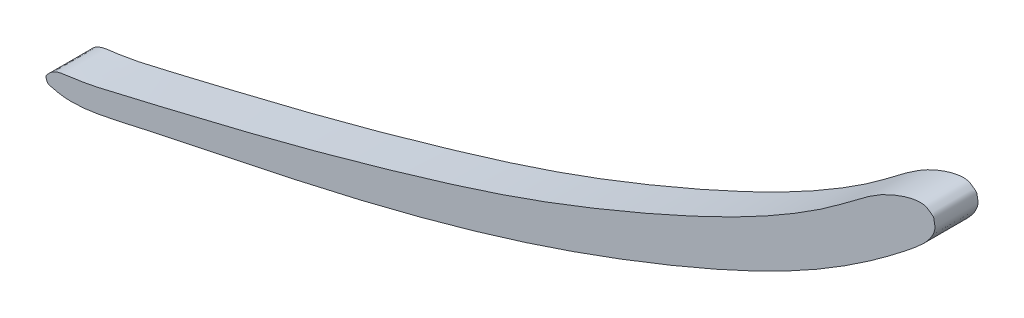
ISO-10303-21;
HEADER;
FILE_DESCRIPTION(('STEP AP214'),'2;1');
FILE_NAME('part.step','',(''),(''),'','','');
FILE_SCHEMA(('AUTOMOTIVE_DESIGN { 1 0 10303 214 1 1 1 1 }'));
ENDSEC;
DATA;
#1=APPLICATION_CONTEXT('core data for automotive mechanical design processes');
#2=APPLICATION_PROTOCOL_DEFINITION('international standard','automotive_design',2000,#1);
#3=PRODUCT_CONTEXT('',#1,'mechanical');
#4=PRODUCT('Part','Part','',(#3));
#5=PRODUCT_RELATED_PRODUCT_CATEGORY('part','',(#4));
#6=PRODUCT_DEFINITION_FORMATION('','',#4);
#7=PRODUCT_DEFINITION_CONTEXT('part definition',#1,'design');
#8=PRODUCT_DEFINITION('design','',#6,#7);
#9=PRODUCT_DEFINITION_SHAPE('','',#8);
#10=(LENGTH_UNIT() NAMED_UNIT(*) SI_UNIT(.MILLI.,.METRE.));
#11=(NAMED_UNIT(*) PLANE_ANGLE_UNIT() SI_UNIT($,.RADIAN.));
#12=(NAMED_UNIT(*) SI_UNIT($,.STERADIAN.) SOLID_ANGLE_UNIT());
#13=UNCERTAINTY_MEASURE_WITH_UNIT(LENGTH_MEASURE(1.E-05),#10,'distance_accuracy_value','');
#14=(GEOMETRIC_REPRESENTATION_CONTEXT(3) GLOBAL_UNCERTAINTY_ASSIGNED_CONTEXT((#13)) GLOBAL_UNIT_ASSIGNED_CONTEXT((#10,
#11,#12)) REPRESENTATION_CONTEXT('',''));
#15=CARTESIAN_POINT('',(0.,0.,0.));
#16=DIRECTION('',(0.,0.,1.));
#17=DIRECTION('',(1.,0.,0.));
#18=AXIS2_PLACEMENT_3D('',#15,#16,#17);
#19=CARTESIAN_POINT('',(94.8993334063321,0.,236.));
#20=CARTESIAN_POINT('',(94.845659962282,0.10574347563716,236.));
#21=CARTESIAN_POINT('',(94.7575121961252,0.184789814009305,236.));
#22=CARTESIAN_POINT('',(94.5752324341787,0.331419849592051,236.));
#23=CARTESIAN_POINT('',(94.4797080052577,0.398887362654459,236.));
#24=CARTESIAN_POINT('',(94.2915303185674,0.537651560472318,236.));
#25=CARTESIAN_POINT('',(94.1987281030679,0.608749585971756,236.));
#26=CARTESIAN_POINT('',(94.0082274871494,0.744415781485045,236.));
#27=CARTESIAN_POINT('',(93.9106305464372,0.808993365388635,236.));
#28=CARTESIAN_POINT('',(93.7110634555962,0.927901913294511,236.));
#29=CARTESIAN_POINT('',(93.6088564237515,0.982334590551361,236.));
#30=CARTESIAN_POINT('',(93.3952170026852,1.07208449896127,236.));
#31=CARTESIAN_POINT('',(93.2832377250923,1.10777381099563,236.));
#32=CARTESIAN_POINT('',(92.9398253533877,1.18933912122585,236.));
#33=CARTESIAN_POINT('',(92.7084219061872,1.20881353192816,236.));
#34=CARTESIAN_POINT('',(92.2431673506536,1.21306127725326,236.));
#35=CARTESIAN_POINT('',(92.0085660183177,1.19696276883999,236.));
#36=CARTESIAN_POINT('',(91.5462446156635,1.14699858187851,236.));
#37=CARTESIAN_POINT('',(91.3172127955302,1.11292895073162,236.));
#38=CARTESIAN_POINT('',(90.6358296163531,0.98633608935454,236.));
#39=CARTESIAN_POINT('',(90.1888606354073,0.870837145947229,236.));
#40=CARTESIAN_POINT('',(89.3017422963028,0.610728391355328,236.));
#41=CARTESIAN_POINT('',(88.8608720042973,0.464242027258985,236.));
#42=CARTESIAN_POINT('',(87.9910265645425,0.144206180317177,236.));
#43=CARTESIAN_POINT('',(87.5631805195455,-0.0283074348496961,236.));
#44=CARTESIAN_POINT('',(86.2991738542889,-0.580336119384259,236.));
#45=CARTESIAN_POINT('',(85.4831837217098,-0.995467378512295,236.));
#46=CARTESIAN_POINT('',(83.112708951334,-2.37769964058918,236.));
#47=CARTESIAN_POINT('',(81.6309065104896,-3.47334237152288,236.));
#48=CARTESIAN_POINT('',(79.4256204048164,-5.14680176586649,236.));
#49=CARTESIAN_POINT('',(78.6926849649439,-5.70835547103491,236.));
#50=CARTESIAN_POINT('',(77.2164171648756,-6.81348954067823,236.));
#51=CARTESIAN_POINT('',(76.474251974588,-7.35908761248904,236.));
#52=CARTESIAN_POINT('',(74.2255779214643,-8.95754149200038,236.));
#53=CARTESIAN_POINT('',(72.6961443029432,-9.97076686766624,236.));
#54=CARTESIAN_POINT('',(69.5963703092606,-11.9265013827565,236.));
#55=CARTESIAN_POINT('',(68.0264697617931,-12.8697708601218,236.));
#56=CARTESIAN_POINT('',(64.8567850296274,-14.7046494407795,236.));
#57=CARTESIAN_POINT('',(63.2567477410818,-15.5958209989586,236.));
#58=CARTESIAN_POINT('',(60.0260420150196,-17.3252115044312,236.));
#59=CARTESIAN_POINT('',(58.3957153065694,-18.1640212048269,236.));
#60=CARTESIAN_POINT('',(55.1112165780077,-19.8004187921286,236.));
#61=CARTESIAN_POINT('',(53.4570793426944,-20.5980668121328,236.));
#62=CARTESIAN_POINT('',(50.1319107351389,-22.1641576577852,236.));
#63=CARTESIAN_POINT('',(48.4606430591419,-22.9327064860528,236.));
#64=CARTESIAN_POINT('',(43.4262180529838,-25.1993773488672,236.));
#65=CARTESIAN_POINT('',(40.0465822894201,-26.6581098173429,236.));
#66=CARTESIAN_POINT('',(33.2512701992013,-29.4875745922943,236.));
#67=CARTESIAN_POINT('',(29.8363752070499,-30.8583721150458,236.));
#68=CARTESIAN_POINT('',(22.9642977919051,-33.4921941887389,236.));
#69=CARTESIAN_POINT('',(19.504227101559,-34.7510328278099,236.));
#70=CARTESIAN_POINT('',(12.5431362385993,-37.1412530390086,236.));
#71=CARTESIAN_POINT('',(9.04228151569951,-38.2744401190943,236.));
#72=CARTESIAN_POINT('',(2.01358556682683,-40.4585324367449,236.));
#73=CARTESIAN_POINT('',(-1.51305224799162,-41.5130137631934,236.));
#74=CARTESIAN_POINT('',(-8.57869076777038,-43.5758347366254,236.));
#75=CARTESIAN_POINT('',(-12.1180672431602,-44.5845299271085,236.));
#76=CARTESIAN_POINT('',(-19.2128319026667,-46.5464530587658,236.));
#77=CARTESIAN_POINT('',(-22.768312200971,-47.497524978792,236.));
#78=CARTESIAN_POINT('',(-33.4559882572697,-50.2672577594373,236.));
#79=CARTESIAN_POINT('',(-40.6115264376822,-51.9965460023696,236.));
#80=CARTESIAN_POINT('',(-51.3469605504554,-54.578262709755,236.));
#81=CARTESIAN_POINT('',(-54.9270215352491,-55.4323445134834,236.));
#82=CARTESIAN_POINT('',(-59.408482704292,-56.4726589746531,236.));
#83=CARTESIAN_POINT('',(-60.3053792883959,-56.6782764626265,236.));
#84=CARTESIAN_POINT('',(-62.1072276632954,-57.0478429262739,236.));
#85=CARTESIAN_POINT('',(-63.0125379510804,-57.2101471671624,236.));
#86=CARTESIAN_POINT('',(-64.3792172031136,-57.4092217634968,236.));
#87=CARTESIAN_POINT('',(-64.8368888295141,-57.4654563544162,236.));
#88=CARTESIAN_POINT('',(-65.7527222495231,-57.575575842784,236.));
#89=CARTESIAN_POINT('',(-66.2101950778906,-57.6327634032875,236.));
#90=CARTESIAN_POINT('',(-67.1162494381898,-57.7897603497645,236.));
#91=CARTESIAN_POINT('',(-67.5658472350484,-57.884698110249,236.));
#92=CARTESIAN_POINT('',(-68.2212652755757,-58.11808191237,236.));
#93=CARTESIAN_POINT('',(-68.4366874033342,-58.2118440110858,236.));
#94=CARTESIAN_POINT('',(-68.8549800218126,-58.4541141360905,236.));
#95=CARTESIAN_POINT('',(-69.0448291336182,-58.5992446026175,236.));
#96=CARTESIAN_POINT('',(-69.3133343024742,-58.8371696234882,236.));
#97=CARTESIAN_POINT('',(-69.399594956957,-58.920508121404,236.));
#98=CARTESIAN_POINT('',(-69.568893492128,-59.09119252606,236.));
#99=CARTESIAN_POINT('',(-69.6535229445691,-59.1766337586494,236.));
#100=CARTESIAN_POINT('',(-69.8158723592367,-59.3540092957443,236.));
#101=CARTESIAN_POINT('',(-69.8956570645381,-59.444535845131,236.));
#102=CARTESIAN_POINT('',(-69.9793641545226,-59.6056575366219,236.));
#103=CARTESIAN_POINT('',(-69.9990405096811,-59.6622389454471,236.));
#104=CARTESIAN_POINT('',(-70.0164031243084,-59.7817574298725,236.));
#105=CARTESIAN_POINT('',(-70.0149620983814,-59.8422186552406,236.));
#106=CARTESIAN_POINT('',(-69.9927134889943,-60.0205506431109,236.));
#107=CARTESIAN_POINT('',(-69.9561626156857,-60.1364338742434,236.));
#108=CARTESIAN_POINT('',(-69.8757925359856,-60.3618990283482,236.));
#109=CARTESIAN_POINT('',(-69.8304408073495,-60.474706677242,236.));
#110=CARTESIAN_POINT('',(-69.7025491239283,-60.6772536066619,236.));
#111=CARTESIAN_POINT('',(-69.6117969218763,-60.7635344934487,236.));
#112=CARTESIAN_POINT('',(-69.3918010850457,-60.8632674701253,236.));
#113=CARTESIAN_POINT('',(-69.2736904419237,-60.8840727448937,236.));
#114=CARTESIAN_POINT('',(-69.0381596933242,-60.9281569223038,236.));
#115=CARTESIAN_POINT('',(-68.9204793621968,-60.9505921498527,236.));
#116=CARTESIAN_POINT('',(-68.6867319330921,-61.0027579343336,236.));
#117=CARTESIAN_POINT('',(-68.5702859018215,-61.0307770295553,236.));
#118=CARTESIAN_POINT('',(-68.221342867823,-61.116622825597,236.));
#119=CARTESIAN_POINT('',(-67.9894187713092,-61.1770431810379,236.));
#120=CARTESIAN_POINT('',(-67.2867933709865,-61.3272789207023,236.));
#121=CARTESIAN_POINT('',(-66.8107544301198,-61.3834435375895,236.));
#122=CARTESIAN_POINT('',(-65.8653959434507,-61.4451826564057,236.));
#123=CARTESIAN_POINT('',(-65.3930052302857,-61.4537023880178,236.));
#124=CARTESIAN_POINT('',(-64.4485925911503,-61.442175236186,236.));
#125=CARTESIAN_POINT('',(-63.9765929008781,-61.420405953919,236.));
#126=CARTESIAN_POINT('',(-62.5611421798142,-61.3126224014796,236.));
#127=CARTESIAN_POINT('',(-61.6169388551825,-61.1826921362914,236.));
#128=CARTESIAN_POINT('',(-59.7434859708016,-60.8686654093105,236.));
#129=CARTESIAN_POINT('',(-58.8116320355266,-60.6858132251472,236.));
#130=CARTESIAN_POINT('',(-56.952046788293,-60.2982466560236,236.));
#131=CARTESIAN_POINT('',(-56.0240934413455,-60.0945306277706,236.));
#132=CARTESIAN_POINT('',(-54.1691976662962,-59.6829938855136,236.));
#133=CARTESIAN_POINT('',(-53.2423155806067,-59.4746379649703,236.));
#134=CARTESIAN_POINT('',(-51.387729652937,-59.0616842152805,236.));
#135=CARTESIAN_POINT('',(-50.4601242814259,-58.8566360567276,236.));
#136=CARTESIAN_POINT('',(-45.8200008612031,-57.8409833549949,236.));
#137=CARTESIAN_POINT('',(-42.0996264423265,-57.0663217504028,236.));
#138=CARTESIAN_POINT('',(-34.6573999854637,-55.5250216757402,236.));
#139=CARTESIAN_POINT('',(-30.9361685830982,-54.7549176463273,236.));
#140=CARTESIAN_POINT('',(-23.5047638839917,-53.1636169902018,236.));
#141=CARTESIAN_POINT('',(-19.7942737665503,-52.3438841940062,236.));
#142=CARTESIAN_POINT('',(-12.3892516701427,-50.6306860139156,236.));
#143=CARTESIAN_POINT('',(-8.69562078334134,-49.7376855806766,236.));
#144=CARTESIAN_POINT('',(2.35067968557324,-46.9279447515948,236.));
#145=CARTESIAN_POINT('',(9.67429923713327,-44.8805471060069,236.));
#146=CARTESIAN_POINT('',(20.5490463400518,-41.471415932534,236.));
#147=CARTESIAN_POINT('',(24.1554752251217,-40.2777334485113,236.));
#148=CARTESIAN_POINT('',(31.3314240498974,-37.7759581430795,236.));
#149=CARTESIAN_POINT('',(34.9009143914805,-36.4683333707956,236.));
#150=CARTESIAN_POINT('',(41.9982753693278,-33.7483005251458,236.));
#151=CARTESIAN_POINT('',(45.527616412723,-32.3356579813824,236.));
#152=CARTESIAN_POINT('',(52.5250725045685,-29.4018404757838,236.));
#153=CARTESIAN_POINT('',(55.9955448549883,-27.8804277068014,236.));
#154=CARTESIAN_POINT('',(62.855518539499,-24.6814125757005,236.));
#155=CARTESIAN_POINT('',(66.2446844216162,-23.0031631412142,236.));
#156=CARTESIAN_POINT('',(72.8964034679001,-19.4024338080693,236.));
#157=CARTESIAN_POINT('',(76.1577318643198,-17.4775913853282,236.));
#158=CARTESIAN_POINT('',(80.9329713186802,-14.3651159865289,236.));
#159=CARTESIAN_POINT('',(82.5055467222721,-13.2906439993564,236.));
#160=CARTESIAN_POINT('',(85.6142850967992,-11.0714620151705,236.));
#161=CARTESIAN_POINT('',(87.1493874300769,-9.92781777387327,236.));
#162=CARTESIAN_POINT('',(89.420119474189,-8.17493091228376,236.));
#163=CARTESIAN_POINT('',(90.1722166839794,-7.58435747757821,236.));
#164=CARTESIAN_POINT('',(91.2819535081383,-6.67586794783546,236.));
#165=CARTESIAN_POINT('',(91.6483315781095,-6.36814954789557,236.));
#166=CARTESIAN_POINT('',(92.3657090164772,-5.73670417681767,236.));
#167=CARTESIAN_POINT('',(92.7175824247351,-5.41395187034948,236.));
#168=CARTESIAN_POINT('',(93.3921476119945,-4.73834800090027,236.));
#169=CARTESIAN_POINT('',(93.7160332069544,-4.38332704298559,236.));
#170=CARTESIAN_POINT('',(94.3032889718857,-3.62919616550645,236.));
#171=CARTESIAN_POINT('',(94.5654559862763,-3.2283628529837,236.));
#172=CARTESIAN_POINT('',(94.8783318794382,-2.57983148651046,236.));
#173=CARTESIAN_POINT('',(94.9690950709799,-2.35857097186131,236.));
#174=CARTESIAN_POINT('',(95.1036743357612,-1.89840971521952,236.));
#175=CARTESIAN_POINT('',(95.1473827535376,-1.65953030941838,236.));
#176=CARTESIAN_POINT('',(95.1461822879227,-1.18446888680955,236.));
#177=CARTESIAN_POINT('',(95.0950856365154,-0.945558427198397,236.));
#178=CARTESIAN_POINT('',(95.0221785278918,-0.590872909540454,236.));
#179=CARTESIAN_POINT('',(95.0026731351032,-0.471674340030483,236.));
#180=CARTESIAN_POINT('',(94.9762833070258,-0.292296454653052,236.));
#181=CARTESIAN_POINT('',(94.9680473022073,-0.232390458525038,236.));
#182=CARTESIAN_POINT('',(94.9499352735133,-0.143695874222442,236.));
#183=CARTESIAN_POINT('',(94.9428097692585,-0.114351065085511,236.));
#184=CARTESIAN_POINT('',(94.9245894839342,-0.0564641296762489,236.));
#185=CARTESIAN_POINT('',(94.9127517673447,-0.0264358689092863,236.));
#186=CARTESIAN_POINT('',(94.8993334063321,0.,236.));
#187=B_SPLINE_CURVE_WITH_KNOTS('',3,(#19,#20,#21,#22,#23,#24,#25,#26,#27,#28,#29,#30,#31,#32,
#33,#34,#35,#36,#37,#38,#39,#40,#41,#42,#43,#44,#45,#46,#47,#48,#49,#50,#51,#52,#53,#54,#55,#56,
#57,#58,#59,#60,#61,#62,#63,#64,#65,#66,#67,#68,#69,#70,#71,#72,#73,#74,#75,#76,#77,#78,#79,#80,
#81,#82,#83,#84,#85,#86,#87,#88,#89,#90,#91,#92,#93,#94,#95,#96,#97,#98,#99,#100,#101,#102,#103,
#104,#105,#106,#107,#108,#109,#110,#111,#112,#113,#114,#115,#116,#117,#118,#119,#120,#121,#122,
#123,#124,#125,#126,#127,#128,#129,#130,#131,#132,#133,#134,#135,#136,#137,#138,#139,#140,#141,
#142,#143,#144,#145,#146,#147,#148,#149,#150,#151,#152,#153,#154,#155,#156,#157,#158,#159,#160,
#161,#162,#163,#164,#165,#166,#167,#168,#169,#170,#171,#172,#173,#174,#175,#176,#177,#178,#179,
#180,#181,#182,#183,#184,#185,#186),.UNSPECIFIED.,.T.,.F.,(4,2,2,2,2,2,2,2,2,2,2,2,2,2,2,2,2,2,
2,2,2,2,2,2,2,2,2,2,2,2,2,2,2,2,2,2,2,2,2,2,2,2,2,2,2,2,2,2,2,2,2,2,2,2,2,2,2,2,2,2,2,2,2,2,2,2,
2,2,2,2,2,2,2,2,2,2,2,2,2,2,2,2,2,4),(0.,0.000976562500000015,0.00195312500000003,
0.00292968750000004,0.00390625000000006,0.00488281250000007,0.00585937500000009,0.0078125,
0.00976562499999992,0.0117187499999998,0.0156249999999997,0.0195312499999995,0.0234374999999993,
0.031249999999999,0.0468749999999983,0.054687499999998,0.0624999999999977,0.078124999999997,
0.0937499999999963,0.109374999999996,0.124999999999995,0.140624999999994,0.156249999999994,
0.187499999999993,0.218749999999991,0.24999999999999,0.281249999999989,0.312499999999988,
0.343749999999987,0.374999999999985,0.437499999999983,0.468749999999982,0.476562499999981,
0.484374999999981,0.488281249999981,0.492187499999981,0.496093749999981,0.498046874999981,
0.49999999999998,0.50097656249998,0.50195312499998,0.50292968749998,0.50341796874998,
0.503906249999981,0.50488281249998,0.50585937499998,0.50683593749998,0.50781249999998,
0.50878906249998,0.50976562499998,0.51171874999998,0.51562499999998,0.51953124999998,
0.52343749999998,0.531249999999981,0.539062499999981,0.546874999999981,0.554687499999982,
0.562499999999982,0.593749999999984,0.624999999999985,0.656249999999986,0.687499999999988,
0.74999999999999,0.781249999999992,0.812499999999993,0.843749999999994,0.874999999999995,
0.906249999999996,0.937499999999998,0.953124999999998,0.968749999999999,0.976562499999999,
0.980468749999999,0.984375,0.98828125,0.9921875,0.994140625,0.99609375,0.998046875,0.9990234375,
0.99951171875,0.999755859375,1.),.UNSPECIFIED.);
#188=DIRECTION('',(0.,0.,-1.));
#189=VECTOR('',#188,1.);
#190=SURFACE_OF_LINEAR_EXTRUSION('',#187,#189);
#191=CARTESIAN_POINT('',(94.8993334063321,0.,236.));
#192=CARTESIAN_POINT('',(94.9127517673447,-0.0264358689092863,236.));
#193=CARTESIAN_POINT('',(94.9245894839342,-0.0564641296762489,236.));
#194=CARTESIAN_POINT('',(94.9428097692585,-0.114351065085511,236.));
#195=CARTESIAN_POINT('',(94.9499352735133,-0.143695874222442,236.));
#196=CARTESIAN_POINT('',(94.9680473022073,-0.232390458525038,236.));
#197=CARTESIAN_POINT('',(94.9762833070258,-0.292296454653052,236.));
#198=CARTESIAN_POINT('',(95.0026731351032,-0.471674340030483,236.));
#199=CARTESIAN_POINT('',(95.0221785278918,-0.590872909540454,236.));
#200=CARTESIAN_POINT('',(95.0950856365154,-0.945558427198397,236.));
#201=CARTESIAN_POINT('',(95.1461822879227,-1.18446888680955,236.));
#202=CARTESIAN_POINT('',(95.1473827535376,-1.65953030941838,236.));
#203=CARTESIAN_POINT('',(95.1036743357612,-1.89840971521952,236.));
#204=CARTESIAN_POINT('',(94.9690950709799,-2.35857097186131,236.));
#205=CARTESIAN_POINT('',(94.8783318794382,-2.57983148651046,236.));
#206=CARTESIAN_POINT('',(94.5654559862763,-3.2283628529837,236.));
#207=CARTESIAN_POINT('',(94.3032889718857,-3.62919616550645,236.));
#208=CARTESIAN_POINT('',(93.7160332069544,-4.38332704298559,236.));
#209=CARTESIAN_POINT('',(93.3921476119945,-4.73834800090027,236.));
#210=CARTESIAN_POINT('',(92.7175824247351,-5.41395187034948,236.));
#211=CARTESIAN_POINT('',(92.3657090164772,-5.73670417681767,236.));
#212=CARTESIAN_POINT('',(91.6483315781095,-6.36814954789557,236.));
#213=CARTESIAN_POINT('',(91.2819535081383,-6.67586794783546,236.));
#214=CARTESIAN_POINT('',(90.1722166839794,-7.58435747757821,236.));
#215=CARTESIAN_POINT('',(89.420119474189,-8.17493091228376,236.));
#216=CARTESIAN_POINT('',(87.1493874300769,-9.92781777387327,236.));
#217=CARTESIAN_POINT('',(85.6142850967992,-11.0714620151705,236.));
#218=CARTESIAN_POINT('',(82.5055467222721,-13.2906439993564,236.));
#219=CARTESIAN_POINT('',(80.9329713186802,-14.3651159865289,236.));
#220=CARTESIAN_POINT('',(76.1577318643198,-17.4775913853282,236.));
#221=CARTESIAN_POINT('',(72.8964034679001,-19.4024338080693,236.));
#222=CARTESIAN_POINT('',(66.2446844216162,-23.0031631412142,236.));
#223=CARTESIAN_POINT('',(62.855518539499,-24.6814125757005,236.));
#224=CARTESIAN_POINT('',(55.9955448549883,-27.8804277068014,236.));
#225=CARTESIAN_POINT('',(52.5250725045685,-29.4018404757838,236.));
#226=CARTESIAN_POINT('',(45.527616412723,-32.3356579813824,236.));
#227=CARTESIAN_POINT('',(41.9982753693278,-33.7483005251458,236.));
#228=CARTESIAN_POINT('',(34.9009143914805,-36.4683333707956,236.));
#229=CARTESIAN_POINT('',(31.3314240498974,-37.7759581430795,236.));
#230=CARTESIAN_POINT('',(24.1554752251217,-40.2777334485113,236.));
#231=CARTESIAN_POINT('',(20.5490463400518,-41.471415932534,236.));
#232=CARTESIAN_POINT('',(9.67429923713327,-44.8805471060069,236.));
#233=CARTESIAN_POINT('',(2.35067968557324,-46.9279447515948,236.));
#234=CARTESIAN_POINT('',(-8.69562078334134,-49.7376855806766,236.));
#235=CARTESIAN_POINT('',(-12.3892516701427,-50.6306860139156,236.));
#236=CARTESIAN_POINT('',(-19.7942737665503,-52.3438841940062,236.));
#237=CARTESIAN_POINT('',(-23.5047638839917,-53.1636169902018,236.));
#238=CARTESIAN_POINT('',(-30.9361685830982,-54.7549176463273,236.));
#239=CARTESIAN_POINT('',(-34.6573999854637,-55.5250216757402,236.));
#240=CARTESIAN_POINT('',(-42.0996264423265,-57.0663217504028,236.));
#241=CARTESIAN_POINT('',(-45.8200008612031,-57.8409833549949,236.));
#242=CARTESIAN_POINT('',(-50.4601242814259,-58.8566360567276,236.));
#243=CARTESIAN_POINT('',(-51.387729652937,-59.0616842152805,236.));
#244=CARTESIAN_POINT('',(-53.2423155806067,-59.4746379649703,236.));
#245=CARTESIAN_POINT('',(-54.1691976662962,-59.6829938855136,236.));
#246=CARTESIAN_POINT('',(-56.0240934413455,-60.0945306277706,236.));
#247=CARTESIAN_POINT('',(-56.952046788293,-60.2982466560236,236.));
#248=CARTESIAN_POINT('',(-58.8116320355266,-60.6858132251472,236.));
#249=CARTESIAN_POINT('',(-59.7434859708016,-60.8686654093105,236.));
#250=CARTESIAN_POINT('',(-61.6169388551825,-61.1826921362914,236.));
#251=CARTESIAN_POINT('',(-62.5611421798142,-61.3126224014796,236.));
#252=CARTESIAN_POINT('',(-63.9765929008781,-61.420405953919,236.));
#253=CARTESIAN_POINT('',(-64.4485925911503,-61.442175236186,236.));
#254=CARTESIAN_POINT('',(-65.3930052302857,-61.4537023880178,236.));
#255=CARTESIAN_POINT('',(-65.8653959434507,-61.4451826564057,236.));
#256=CARTESIAN_POINT('',(-66.8107544301198,-61.3834435375895,236.));
#257=CARTESIAN_POINT('',(-67.2867933709865,-61.3272789207023,236.));
#258=CARTESIAN_POINT('',(-67.9894187713092,-61.1770431810379,236.));
#259=CARTESIAN_POINT('',(-68.221342867823,-61.116622825597,236.));
#260=CARTESIAN_POINT('',(-68.5702859018215,-61.0307770295553,236.));
#261=CARTESIAN_POINT('',(-68.6867319330921,-61.0027579343336,236.));
#262=CARTESIAN_POINT('',(-68.9204793621968,-60.9505921498527,236.));
#263=CARTESIAN_POINT('',(-69.0381596933242,-60.9281569223038,236.));
#264=CARTESIAN_POINT('',(-69.2736904419237,-60.8840727448937,236.));
#265=CARTESIAN_POINT('',(-69.3918010850457,-60.8632674701253,236.));
#266=CARTESIAN_POINT('',(-69.6117969218763,-60.7635344934487,236.));
#267=CARTESIAN_POINT('',(-69.7025491239283,-60.6772536066619,236.));
#268=CARTESIAN_POINT('',(-69.8304408073495,-60.474706677242,236.));
#269=CARTESIAN_POINT('',(-69.8757925359856,-60.3618990283482,236.));
#270=CARTESIAN_POINT('',(-69.9561626156857,-60.1364338742434,236.));
#271=CARTESIAN_POINT('',(-69.9927134889943,-60.0205506431109,236.));
#272=CARTESIAN_POINT('',(-70.0149620983814,-59.8422186552406,236.));
#273=CARTESIAN_POINT('',(-70.0164031243084,-59.7817574298725,236.));
#274=CARTESIAN_POINT('',(-69.9990405096811,-59.6622389454471,236.));
#275=CARTESIAN_POINT('',(-69.9793641545226,-59.6056575366219,236.));
#276=CARTESIAN_POINT('',(-69.8956570645381,-59.444535845131,236.));
#277=CARTESIAN_POINT('',(-69.8158723592367,-59.3540092957443,236.));
#278=CARTESIAN_POINT('',(-69.6535229445691,-59.1766337586494,236.));
#279=CARTESIAN_POINT('',(-69.568893492128,-59.09119252606,236.));
#280=CARTESIAN_POINT('',(-69.399594956957,-58.920508121404,236.));
#281=CARTESIAN_POINT('',(-69.3133343024742,-58.8371696234882,236.));
#282=CARTESIAN_POINT('',(-69.0448291336182,-58.5992446026175,236.));
#283=CARTESIAN_POINT('',(-68.8549800218126,-58.4541141360905,236.));
#284=CARTESIAN_POINT('',(-68.4366874033342,-58.2118440110858,236.));
#285=CARTESIAN_POINT('',(-68.2212652755757,-58.11808191237,236.));
#286=CARTESIAN_POINT('',(-67.5658472350484,-57.884698110249,236.));
#287=CARTESIAN_POINT('',(-67.1162494381898,-57.7897603497645,236.));
#288=CARTESIAN_POINT('',(-66.2101950778906,-57.6327634032875,236.));
#289=CARTESIAN_POINT('',(-65.7527222495231,-57.575575842784,236.));
#290=CARTESIAN_POINT('',(-64.8368888295141,-57.4654563544162,236.));
#291=CARTESIAN_POINT('',(-64.3792172031136,-57.4092217634968,236.));
#292=CARTESIAN_POINT('',(-63.0125379510804,-57.2101471671624,236.));
#293=CARTESIAN_POINT('',(-62.1072276632954,-57.0478429262739,236.));
#294=CARTESIAN_POINT('',(-60.3053792883959,-56.6782764626265,236.));
#295=CARTESIAN_POINT('',(-59.408482704292,-56.4726589746531,236.));
#296=CARTESIAN_POINT('',(-54.9270215352491,-55.4323445134834,236.));
#297=CARTESIAN_POINT('',(-51.3469605504554,-54.578262709755,236.));
#298=CARTESIAN_POINT('',(-40.6115264376822,-51.9965460023696,236.));
#299=CARTESIAN_POINT('',(-33.4559882572697,-50.2672577594373,236.));
#300=CARTESIAN_POINT('',(-22.768312200971,-47.497524978792,236.));
#301=CARTESIAN_POINT('',(-19.2128319026667,-46.5464530587658,236.));
#302=CARTESIAN_POINT('',(-12.1180672431602,-44.5845299271085,236.));
#303=CARTESIAN_POINT('',(-8.57869076777038,-43.5758347366254,236.));
#304=CARTESIAN_POINT('',(-1.51305224799162,-41.5130137631934,236.));
#305=CARTESIAN_POINT('',(2.01358556682683,-40.4585324367449,236.));
#306=CARTESIAN_POINT('',(9.04228151569951,-38.2744401190943,236.));
#307=CARTESIAN_POINT('',(12.5431362385993,-37.1412530390086,236.));
#308=CARTESIAN_POINT('',(19.504227101559,-34.7510328278099,236.));
#309=CARTESIAN_POINT('',(22.9642977919051,-33.4921941887389,236.));
#310=CARTESIAN_POINT('',(29.8363752070499,-30.8583721150458,236.));
#311=CARTESIAN_POINT('',(33.2512701992013,-29.4875745922943,236.));
#312=CARTESIAN_POINT('',(40.0465822894201,-26.6581098173429,236.));
#313=CARTESIAN_POINT('',(43.4262180529838,-25.1993773488672,236.));
#314=CARTESIAN_POINT('',(48.4606430591419,-22.9327064860528,236.));
#315=CARTESIAN_POINT('',(50.1319107351389,-22.1641576577852,236.));
#316=CARTESIAN_POINT('',(53.4570793426944,-20.5980668121328,236.));
#317=CARTESIAN_POINT('',(55.1112165780077,-19.8004187921286,236.));
#318=CARTESIAN_POINT('',(58.3957153065694,-18.1640212048269,236.));
#319=CARTESIAN_POINT('',(60.0260420150196,-17.3252115044312,236.));
#320=CARTESIAN_POINT('',(63.2567477410818,-15.5958209989586,236.));
#321=CARTESIAN_POINT('',(64.8567850296274,-14.7046494407795,236.));
#322=CARTESIAN_POINT('',(68.0264697617931,-12.8697708601218,236.));
#323=CARTESIAN_POINT('',(69.5963703092606,-11.9265013827565,236.));
#324=CARTESIAN_POINT('',(72.6961443029432,-9.97076686766624,236.));
#325=CARTESIAN_POINT('',(74.2255779214643,-8.95754149200038,236.));
#326=CARTESIAN_POINT('',(76.474251974588,-7.35908761248904,236.));
#327=CARTESIAN_POINT('',(77.2164171648756,-6.81348954067823,236.));
#328=CARTESIAN_POINT('',(78.6926849649439,-5.70835547103491,236.));
#329=CARTESIAN_POINT('',(79.4256204048164,-5.14680176586649,236.));
#330=CARTESIAN_POINT('',(81.6309065104896,-3.47334237152288,236.));
#331=CARTESIAN_POINT('',(83.112708951334,-2.37769964058918,236.));
#332=CARTESIAN_POINT('',(85.4831837217098,-0.995467378512295,236.));
#333=CARTESIAN_POINT('',(86.2991738542889,-0.580336119384259,236.));
#334=CARTESIAN_POINT('',(87.5631805195455,-0.0283074348496961,236.));
#335=CARTESIAN_POINT('',(87.9910265645425,0.144206180317177,236.));
#336=CARTESIAN_POINT('',(88.8608720042973,0.464242027258985,236.));
#337=CARTESIAN_POINT('',(89.3017422963028,0.610728391355328,236.));
#338=CARTESIAN_POINT('',(90.1888606354073,0.870837145947229,236.));
#339=CARTESIAN_POINT('',(90.6358296163531,0.98633608935454,236.));
#340=CARTESIAN_POINT('',(91.3172127955302,1.11292895073162,236.));
#341=CARTESIAN_POINT('',(91.5462446156635,1.14699858187851,236.));
#342=CARTESIAN_POINT('',(92.0085660183177,1.19696276883999,236.));
#343=CARTESIAN_POINT('',(92.2431673506536,1.21306127725326,236.));
#344=CARTESIAN_POINT('',(92.7084219061872,1.20881353192816,236.));
#345=CARTESIAN_POINT('',(92.9398253533877,1.18933912122585,236.));
#346=CARTESIAN_POINT('',(93.2832377250923,1.10777381099563,236.));
#347=CARTESIAN_POINT('',(93.3952170026852,1.07208449896127,236.));
#348=CARTESIAN_POINT('',(93.6088564237515,0.982334590551361,236.));
#349=CARTESIAN_POINT('',(93.7110634555962,0.927901913294511,236.));
#350=CARTESIAN_POINT('',(93.9106305464372,0.808993365388635,236.));
#351=CARTESIAN_POINT('',(94.0082274871494,0.744415781485045,236.));
#352=CARTESIAN_POINT('',(94.1987281030679,0.608749585971756,236.));
#353=CARTESIAN_POINT('',(94.2915303185674,0.537651560472318,236.));
#354=CARTESIAN_POINT('',(94.4797080052577,0.398887362654459,236.));
#355=CARTESIAN_POINT('',(94.5752324341787,0.331419849592051,236.));
#356=CARTESIAN_POINT('',(94.7575121961252,0.184789814009305,236.));
#357=CARTESIAN_POINT('',(94.845659962282,0.10574347563716,236.));
#358=CARTESIAN_POINT('',(94.8993334063321,0.,236.));
#359=B_SPLINE_CURVE_WITH_KNOTS('',3,(#191,#192,#193,#194,#195,#196,#197,#198,#199,#200,#201,
#202,#203,#204,#205,#206,#207,#208,#209,#210,#211,#212,#213,#214,#215,#216,#217,#218,#219,#220,
#221,#222,#223,#224,#225,#226,#227,#228,#229,#230,#231,#232,#233,#234,#235,#236,#237,#238,#239,
#240,#241,#242,#243,#244,#245,#246,#247,#248,#249,#250,#251,#252,#253,#254,#255,#256,#257,#258,
#259,#260,#261,#262,#263,#264,#265,#266,#267,#268,#269,#270,#271,#272,#273,#274,#275,#276,#277,
#278,#279,#280,#281,#282,#283,#284,#285,#286,#287,#288,#289,#290,#291,#292,#293,#294,#295,#296,
#297,#298,#299,#300,#301,#302,#303,#304,#305,#306,#307,#308,#309,#310,#311,#312,#313,#314,#315,
#316,#317,#318,#319,#320,#321,#322,#323,#324,#325,#326,#327,#328,#329,#330,#331,#332,#333,#334,
#335,#336,#337,#338,#339,#340,#341,#342,#343,#344,#345,#346,#347,#348,#349,#350,#351,#352,#353,
#354,#355,#356,#357,#358),.UNSPECIFIED.,.T.,.F.,(4,2,2,2,2,2,2,2,2,2,2,2,2,2,2,2,2,2,2,2,2,2,2,
2,2,2,2,2,2,2,2,2,2,2,2,2,2,2,2,2,2,2,2,2,2,2,2,2,2,2,2,2,2,2,2,2,2,2,2,2,2,2,2,2,2,2,2,2,2,2,2,
2,2,2,2,2,2,2,2,2,2,2,2,4),(0.,0.000244140625,0.00048828125,0.0009765625,0.001953125,
0.00390625000000011,0.00585937500000011,0.00781250000000011,0.0117187500000003,
0.0156250000000004,0.0195312500000007,0.0234375000000008,0.0312500000000011,0.0468750000000017,
0.0625000000000022,0.0937500000000036,0.125000000000005,0.156250000000006,0.187500000000007,
0.218750000000008,0.25000000000001,0.312500000000012,0.343750000000014,0.375000000000015,
0.406250000000016,0.437500000000018,0.445312500000018,0.453125000000019,0.460937500000019,
0.468750000000019,0.47656250000002,0.48046875000002,0.48437500000002,0.48828125000002,
0.49023437500002,0.49121093750002,0.49218750000002,0.49316406250002,0.49414062500002,
0.49511718750002,0.496093750000019,0.49658203125002,0.49707031250002,0.49804687500002,
0.49902343750002,0.50000000000002,0.50195312500002,0.503906250000019,0.507812500000019,
0.511718750000019,0.515625000000019,0.523437500000019,0.531250000000018,0.562500000000017,
0.625000000000015,0.656250000000014,0.687500000000012,0.718750000000011,0.75000000000001,
0.781250000000009,0.812500000000007,0.843750000000006,0.859375000000006,0.875000000000005,
0.890625000000004,0.906250000000004,0.921875000000003,0.937500000000002,0.945312500000002,
0.953125000000002,0.968750000000001,0.976562500000001,0.98046875,0.984375,0.98828125,
0.990234375,0.9921875,0.994140625,0.9951171875,0.99609375,0.9970703125,0.998046875,0.9990234375,
1.),.UNSPECIFIED.);
#360=CARTESIAN_POINT('',(94.8993334063321,0.,236.));
#361=VERTEX_POINT('',#360);
#362=EDGE_CURVE('E10',#361,#361,#359,.F.);
#363=ORIENTED_EDGE('',*,*,#362,.F.);
#364=EDGE_LOOP('',(#363));
#365=FACE_BOUND('',#364,.T.);
#366=CARTESIAN_POINT('',(94.8993334063321,0.,228.));
#367=CARTESIAN_POINT('',(94.845659962282,0.10574347563716,228.));
#368=CARTESIAN_POINT('',(94.7575121961252,0.184789814009305,228.));
#369=CARTESIAN_POINT('',(94.5752324341787,0.331419849592051,228.));
#370=CARTESIAN_POINT('',(94.4797080052577,0.398887362654459,228.));
#371=CARTESIAN_POINT('',(94.2915303185674,0.537651560472318,228.));
#372=CARTESIAN_POINT('',(94.1987281030679,0.608749585971756,228.));
#373=CARTESIAN_POINT('',(94.0082274871494,0.744415781485045,228.));
#374=CARTESIAN_POINT('',(93.9106305464372,0.808993365388635,228.));
#375=CARTESIAN_POINT('',(93.7110634555962,0.927901913294511,228.));
#376=CARTESIAN_POINT('',(93.6088564237515,0.982334590551361,228.));
#377=CARTESIAN_POINT('',(93.3952170026852,1.07208449896127,228.));
#378=CARTESIAN_POINT('',(93.2832377250923,1.10777381099563,228.));
#379=CARTESIAN_POINT('',(92.9398253533877,1.18933912122585,228.));
#380=CARTESIAN_POINT('',(92.7084219061872,1.20881353192816,228.));
#381=CARTESIAN_POINT('',(92.2431673506536,1.21306127725326,228.));
#382=CARTESIAN_POINT('',(92.0085660183177,1.19696276883999,228.));
#383=CARTESIAN_POINT('',(91.5462446156635,1.14699858187851,228.));
#384=CARTESIAN_POINT('',(91.3172127955302,1.11292895073162,228.));
#385=CARTESIAN_POINT('',(90.6358296163531,0.98633608935454,228.));
#386=CARTESIAN_POINT('',(90.1888606354073,0.870837145947229,228.));
#387=CARTESIAN_POINT('',(89.3017422963028,0.610728391355328,228.));
#388=CARTESIAN_POINT('',(88.8608720042973,0.464242027258985,228.));
#389=CARTESIAN_POINT('',(87.9910265645425,0.144206180317177,228.));
#390=CARTESIAN_POINT('',(87.5631805195455,-0.0283074348496961,228.));
#391=CARTESIAN_POINT('',(86.2991738542889,-0.580336119384259,228.));
#392=CARTESIAN_POINT('',(85.4831837217098,-0.995467378512295,228.));
#393=CARTESIAN_POINT('',(83.112708951334,-2.37769964058918,228.));
#394=CARTESIAN_POINT('',(81.6309065104896,-3.47334237152288,228.));
#395=CARTESIAN_POINT('',(79.4256204048164,-5.14680176586649,228.));
#396=CARTESIAN_POINT('',(78.6926849649439,-5.70835547103491,228.));
#397=CARTESIAN_POINT('',(77.2164171648756,-6.81348954067823,228.));
#398=CARTESIAN_POINT('',(76.474251974588,-7.35908761248904,228.));
#399=CARTESIAN_POINT('',(74.2255779214643,-8.95754149200038,228.));
#400=CARTESIAN_POINT('',(72.6961443029432,-9.97076686766624,228.));
#401=CARTESIAN_POINT('',(69.5963703092606,-11.9265013827565,228.));
#402=CARTESIAN_POINT('',(68.0264697617931,-12.8697708601218,228.));
#403=CARTESIAN_POINT('',(64.8567850296274,-14.7046494407795,228.));
#404=CARTESIAN_POINT('',(63.2567477410818,-15.5958209989586,228.));
#405=CARTESIAN_POINT('',(60.0260420150196,-17.3252115044312,228.));
#406=CARTESIAN_POINT('',(58.3957153065694,-18.1640212048269,228.));
#407=CARTESIAN_POINT('',(55.1112165780077,-19.8004187921286,228.));
#408=CARTESIAN_POINT('',(53.4570793426944,-20.5980668121328,228.));
#409=CARTESIAN_POINT('',(50.1319107351389,-22.1641576577852,228.));
#410=CARTESIAN_POINT('',(48.4606430591419,-22.9327064860528,228.));
#411=CARTESIAN_POINT('',(43.4262180529838,-25.1993773488672,228.));
#412=CARTESIAN_POINT('',(40.0465822894201,-26.6581098173429,228.));
#413=CARTESIAN_POINT('',(33.2512701992013,-29.4875745922943,228.));
#414=CARTESIAN_POINT('',(29.8363752070499,-30.8583721150458,228.));
#415=CARTESIAN_POINT('',(22.9642977919051,-33.4921941887389,228.));
#416=CARTESIAN_POINT('',(19.504227101559,-34.7510328278099,228.));
#417=CARTESIAN_POINT('',(12.5431362385993,-37.1412530390086,228.));
#418=CARTESIAN_POINT('',(9.04228151569951,-38.2744401190943,228.));
#419=CARTESIAN_POINT('',(2.01358556682683,-40.4585324367449,228.));
#420=CARTESIAN_POINT('',(-1.51305224799162,-41.5130137631934,228.));
#421=CARTESIAN_POINT('',(-8.57869076777038,-43.5758347366254,228.));
#422=CARTESIAN_POINT('',(-12.1180672431602,-44.5845299271085,228.));
#423=CARTESIAN_POINT('',(-19.2128319026667,-46.5464530587658,228.));
#424=CARTESIAN_POINT('',(-22.768312200971,-47.497524978792,228.));
#425=CARTESIAN_POINT('',(-33.4559882572697,-50.2672577594373,228.));
#426=CARTESIAN_POINT('',(-40.6115264376822,-51.9965460023696,228.));
#427=CARTESIAN_POINT('',(-51.3469605504554,-54.578262709755,228.));
#428=CARTESIAN_POINT('',(-54.9270215352491,-55.4323445134834,228.));
#429=CARTESIAN_POINT('',(-59.408482704292,-56.4726589746531,228.));
#430=CARTESIAN_POINT('',(-60.3053792883959,-56.6782764626265,228.));
#431=CARTESIAN_POINT('',(-62.1072276632954,-57.0478429262739,228.));
#432=CARTESIAN_POINT('',(-63.0125379510804,-57.2101471671624,228.));
#433=CARTESIAN_POINT('',(-64.3792172031136,-57.4092217634968,228.));
#434=CARTESIAN_POINT('',(-64.8368888295141,-57.4654563544162,228.));
#435=CARTESIAN_POINT('',(-65.7527222495231,-57.575575842784,228.));
#436=CARTESIAN_POINT('',(-66.2101950778906,-57.6327634032875,228.));
#437=CARTESIAN_POINT('',(-67.1162494381898,-57.7897603497645,228.));
#438=CARTESIAN_POINT('',(-67.5658472350484,-57.884698110249,228.));
#439=CARTESIAN_POINT('',(-68.2212652755757,-58.11808191237,228.));
#440=CARTESIAN_POINT('',(-68.4366874033342,-58.2118440110858,228.));
#441=CARTESIAN_POINT('',(-68.8549800218126,-58.4541141360905,228.));
#442=CARTESIAN_POINT('',(-69.0448291336182,-58.5992446026175,228.));
#443=CARTESIAN_POINT('',(-69.3133343024742,-58.8371696234882,228.));
#444=CARTESIAN_POINT('',(-69.399594956957,-58.920508121404,228.));
#445=CARTESIAN_POINT('',(-69.568893492128,-59.09119252606,228.));
#446=CARTESIAN_POINT('',(-69.6535229445691,-59.1766337586494,228.));
#447=CARTESIAN_POINT('',(-69.8158723592367,-59.3540092957443,228.));
#448=CARTESIAN_POINT('',(-69.8956570645381,-59.444535845131,228.));
#449=CARTESIAN_POINT('',(-69.9793641545226,-59.6056575366219,228.));
#450=CARTESIAN_POINT('',(-69.9990405096811,-59.6622389454471,228.));
#451=CARTESIAN_POINT('',(-70.0164031243084,-59.7817574298725,228.));
#452=CARTESIAN_POINT('',(-70.0149620983814,-59.8422186552406,228.));
#453=CARTESIAN_POINT('',(-69.9927134889943,-60.0205506431109,228.));
#454=CARTESIAN_POINT('',(-69.9561626156857,-60.1364338742434,228.));
#455=CARTESIAN_POINT('',(-69.8757925359856,-60.3618990283482,228.));
#456=CARTESIAN_POINT('',(-69.8304408073495,-60.474706677242,228.));
#457=CARTESIAN_POINT('',(-69.7025491239283,-60.6772536066619,228.));
#458=CARTESIAN_POINT('',(-69.6117969218763,-60.7635344934487,228.));
#459=CARTESIAN_POINT('',(-69.3918010850457,-60.8632674701253,228.));
#460=CARTESIAN_POINT('',(-69.2736904419237,-60.8840727448937,228.));
#461=CARTESIAN_POINT('',(-69.0381596933242,-60.9281569223038,228.));
#462=CARTESIAN_POINT('',(-68.9204793621968,-60.9505921498527,228.));
#463=CARTESIAN_POINT('',(-68.6867319330921,-61.0027579343336,228.));
#464=CARTESIAN_POINT('',(-68.5702859018215,-61.0307770295553,228.));
#465=CARTESIAN_POINT('',(-68.221342867823,-61.116622825597,228.));
#466=CARTESIAN_POINT('',(-67.9894187713092,-61.1770431810379,228.));
#467=CARTESIAN_POINT('',(-67.2867933709865,-61.3272789207023,228.));
#468=CARTESIAN_POINT('',(-66.8107544301198,-61.3834435375895,228.));
#469=CARTESIAN_POINT('',(-65.8653959434507,-61.4451826564057,228.));
#470=CARTESIAN_POINT('',(-65.3930052302857,-61.4537023880178,228.));
#471=CARTESIAN_POINT('',(-64.4485925911503,-61.442175236186,228.));
#472=CARTESIAN_POINT('',(-63.9765929008781,-61.420405953919,228.));
#473=CARTESIAN_POINT('',(-62.5611421798142,-61.3126224014796,228.));
#474=CARTESIAN_POINT('',(-61.6169388551825,-61.1826921362914,228.));
#475=CARTESIAN_POINT('',(-59.7434859708016,-60.8686654093105,228.));
#476=CARTESIAN_POINT('',(-58.8116320355266,-60.6858132251472,228.));
#477=CARTESIAN_POINT('',(-56.952046788293,-60.2982466560236,228.));
#478=CARTESIAN_POINT('',(-56.0240934413455,-60.0945306277706,228.));
#479=CARTESIAN_POINT('',(-54.1691976662962,-59.6829938855136,228.));
#480=CARTESIAN_POINT('',(-53.2423155806067,-59.4746379649703,228.));
#481=CARTESIAN_POINT('',(-51.387729652937,-59.0616842152805,228.));
#482=CARTESIAN_POINT('',(-50.4601242814259,-58.8566360567276,228.));
#483=CARTESIAN_POINT('',(-45.8200008612031,-57.8409833549949,228.));
#484=CARTESIAN_POINT('',(-42.0996264423265,-57.0663217504028,228.));
#485=CARTESIAN_POINT('',(-34.6573999854637,-55.5250216757402,228.));
#486=CARTESIAN_POINT('',(-30.9361685830982,-54.7549176463273,228.));
#487=CARTESIAN_POINT('',(-23.5047638839917,-53.1636169902018,228.));
#488=CARTESIAN_POINT('',(-19.7942737665503,-52.3438841940062,228.));
#489=CARTESIAN_POINT('',(-12.3892516701427,-50.6306860139156,228.));
#490=CARTESIAN_POINT('',(-8.69562078334134,-49.7376855806766,228.));
#491=CARTESIAN_POINT('',(2.35067968557324,-46.9279447515948,228.));
#492=CARTESIAN_POINT('',(9.67429923713327,-44.8805471060069,228.));
#493=CARTESIAN_POINT('',(20.5490463400518,-41.471415932534,228.));
#494=CARTESIAN_POINT('',(24.1554752251217,-40.2777334485113,228.));
#495=CARTESIAN_POINT('',(31.3314240498974,-37.7759581430795,228.));
#496=CARTESIAN_POINT('',(34.9009143914805,-36.4683333707956,228.));
#497=CARTESIAN_POINT('',(41.9982753693278,-33.7483005251458,228.));
#498=CARTESIAN_POINT('',(45.527616412723,-32.3356579813824,228.));
#499=CARTESIAN_POINT('',(52.5250725045685,-29.4018404757838,228.));
#500=CARTESIAN_POINT('',(55.9955448549883,-27.8804277068014,228.));
#501=CARTESIAN_POINT('',(62.855518539499,-24.6814125757005,228.));
#502=CARTESIAN_POINT('',(66.2446844216162,-23.0031631412142,228.));
#503=CARTESIAN_POINT('',(72.8964034679001,-19.4024338080693,228.));
#504=CARTESIAN_POINT('',(76.1577318643198,-17.4775913853282,228.));
#505=CARTESIAN_POINT('',(80.9329713186802,-14.3651159865289,228.));
#506=CARTESIAN_POINT('',(82.5055467222721,-13.2906439993564,228.));
#507=CARTESIAN_POINT('',(85.6142850967992,-11.0714620151705,228.));
#508=CARTESIAN_POINT('',(87.1493874300769,-9.92781777387327,228.));
#509=CARTESIAN_POINT('',(89.420119474189,-8.17493091228376,228.));
#510=CARTESIAN_POINT('',(90.1722166839794,-7.58435747757821,228.));
#511=CARTESIAN_POINT('',(91.2819535081383,-6.67586794783546,228.));
#512=CARTESIAN_POINT('',(91.6483315781095,-6.36814954789557,228.));
#513=CARTESIAN_POINT('',(92.3657090164772,-5.73670417681767,228.));
#514=CARTESIAN_POINT('',(92.7175824247351,-5.41395187034948,228.));
#515=CARTESIAN_POINT('',(93.3921476119945,-4.73834800090027,228.));
#516=CARTESIAN_POINT('',(93.7160332069544,-4.38332704298559,228.));
#517=CARTESIAN_POINT('',(94.3032889718857,-3.62919616550645,228.));
#518=CARTESIAN_POINT('',(94.5654559862763,-3.2283628529837,228.));
#519=CARTESIAN_POINT('',(94.8783318794382,-2.57983148651046,228.));
#520=CARTESIAN_POINT('',(94.9690950709799,-2.35857097186131,228.));
#521=CARTESIAN_POINT('',(95.1036743357612,-1.89840971521952,228.));
#522=CARTESIAN_POINT('',(95.1473827535376,-1.65953030941838,228.));
#523=CARTESIAN_POINT('',(95.1461822879227,-1.18446888680955,228.));
#524=CARTESIAN_POINT('',(95.0950856365154,-0.945558427198397,228.));
#525=CARTESIAN_POINT('',(95.0221785278918,-0.590872909540454,228.));
#526=CARTESIAN_POINT('',(95.0026731351032,-0.471674340030483,228.));
#527=CARTESIAN_POINT('',(94.9762833070258,-0.292296454653052,228.));
#528=CARTESIAN_POINT('',(94.9680473022073,-0.232390458525038,228.));
#529=CARTESIAN_POINT('',(94.9499352735133,-0.143695874222442,228.));
#530=CARTESIAN_POINT('',(94.9428097692585,-0.114351065085511,228.));
#531=CARTESIAN_POINT('',(94.9245894839342,-0.0564641296762489,228.));
#532=CARTESIAN_POINT('',(94.9127517673447,-0.0264358689092863,228.));
#533=CARTESIAN_POINT('',(94.8993334063321,0.,228.));
#534=B_SPLINE_CURVE_WITH_KNOTS('',3,(#366,#367,#368,#369,#370,#371,#372,#373,#374,#375,#376,
#377,#378,#379,#380,#381,#382,#383,#384,#385,#386,#387,#388,#389,#390,#391,#392,#393,#394,#395,
#396,#397,#398,#399,#400,#401,#402,#403,#404,#405,#406,#407,#408,#409,#410,#411,#412,#413,#414,
#415,#416,#417,#418,#419,#420,#421,#422,#423,#424,#425,#426,#427,#428,#429,#430,#431,#432,#433,
#434,#435,#436,#437,#438,#439,#440,#441,#442,#443,#444,#445,#446,#447,#448,#449,#450,#451,#452,
#453,#454,#455,#456,#457,#458,#459,#460,#461,#462,#463,#464,#465,#466,#467,#468,#469,#470,#471,
#472,#473,#474,#475,#476,#477,#478,#479,#480,#481,#482,#483,#484,#485,#486,#487,#488,#489,#490,
#491,#492,#493,#494,#495,#496,#497,#498,#499,#500,#501,#502,#503,#504,#505,#506,#507,#508,#509,
#510,#511,#512,#513,#514,#515,#516,#517,#518,#519,#520,#521,#522,#523,#524,#525,#526,#527,#528,
#529,#530,#531,#532,#533),.UNSPECIFIED.,.T.,.F.,(4,2,2,2,2,2,2,2,2,2,2,2,2,2,2,2,2,2,2,2,2,2,2,
2,2,2,2,2,2,2,2,2,2,2,2,2,2,2,2,2,2,2,2,2,2,2,2,2,2,2,2,2,2,2,2,2,2,2,2,2,2,2,2,2,2,2,2,2,2,2,2,
2,2,2,2,2,2,2,2,2,2,2,2,4),(0.,0.000976562500000015,0.00195312500000003,0.00292968750000004,
0.00390625000000006,0.00488281250000007,0.00585937500000009,0.0078125,0.00976562499999992,
0.0117187499999998,0.0156249999999997,0.0195312499999995,0.0234374999999993,0.031249999999999,
0.0468749999999983,0.054687499999998,0.0624999999999977,0.078124999999997,0.0937499999999963,
0.109374999999996,0.124999999999995,0.140624999999994,0.156249999999994,0.187499999999993,
0.218749999999991,0.24999999999999,0.281249999999989,0.312499999999988,0.343749999999987,
0.374999999999985,0.437499999999983,0.468749999999982,0.476562499999981,0.484374999999981,
0.488281249999981,0.492187499999981,0.496093749999981,0.498046874999981,0.49999999999998,
0.50097656249998,0.50195312499998,0.50292968749998,0.50341796874998,0.503906249999981,
0.50488281249998,0.50585937499998,0.50683593749998,0.50781249999998,0.50878906249998,
0.50976562499998,0.51171874999998,0.51562499999998,0.51953124999998,0.52343749999998,
0.531249999999981,0.539062499999981,0.546874999999981,0.554687499999982,0.562499999999982,
0.593749999999984,0.624999999999985,0.656249999999986,0.687499999999988,0.74999999999999,
0.781249999999992,0.812499999999993,0.843749999999994,0.874999999999995,0.906249999999996,
0.937499999999998,0.953124999999998,0.968749999999999,0.976562499999999,0.980468749999999,
0.984375,0.98828125,0.9921875,0.994140625,0.99609375,0.998046875,0.9990234375,0.99951171875,
0.999755859375,1.),.UNSPECIFIED.);
#535=CARTESIAN_POINT('',(94.8993334063321,0.,228.));
#536=VERTEX_POINT('',#535);
#537=EDGE_CURVE('E38',#536,#536,#534,.T.);
#538=ORIENTED_EDGE('',*,*,#537,.T.);
#539=EDGE_LOOP('',(#538));
#540=FACE_BOUND('',#539,.T.);
#541=ADVANCED_FACE('F28',(#365,#540),#190,.F.);
#542=CARTESIAN_POINT('',(-69.2238325795276,-58.7578612832027,236.));
#543=DIRECTION('',(0.,0.,-1.));
#544=DIRECTION('',(-1.,0.,0.));
#545=AXIS2_PLACEMENT_3D('',#542,#543,#544);
#546=PLANE('',#545);
#547=ORIENTED_EDGE('',*,*,#362,.T.);
#548=EDGE_LOOP('',(#547));
#549=FACE_BOUND('',#548,.T.);
#550=ADVANCED_FACE('F69',(#549),#546,.F.);
#551=CARTESIAN_POINT('',(-69.2238325795276,-58.7578612832027,228.));
#552=DIRECTION('',(0.,0.,-1.));
#553=DIRECTION('',(-1.,0.,0.));
#554=AXIS2_PLACEMENT_3D('',#551,#552,#553);
#555=PLANE('',#554);
#556=ORIENTED_EDGE('',*,*,#537,.F.);
#557=EDGE_LOOP('',(#556));
#558=FACE_BOUND('',#557,.T.);
#559=ADVANCED_FACE('F77',(#558),#555,.T.);
#560=CLOSED_SHELL('',(#541,#550,#559));
#561=MANIFOLD_SOLID_BREP('B2',#560);
#562=ADVANCED_BREP_SHAPE_REPRESENTATION('',(#18,#561),#14);
#563=SHAPE_DEFINITION_REPRESENTATION(#9,#562);
ENDSEC;
END-ISO-10303-21;
